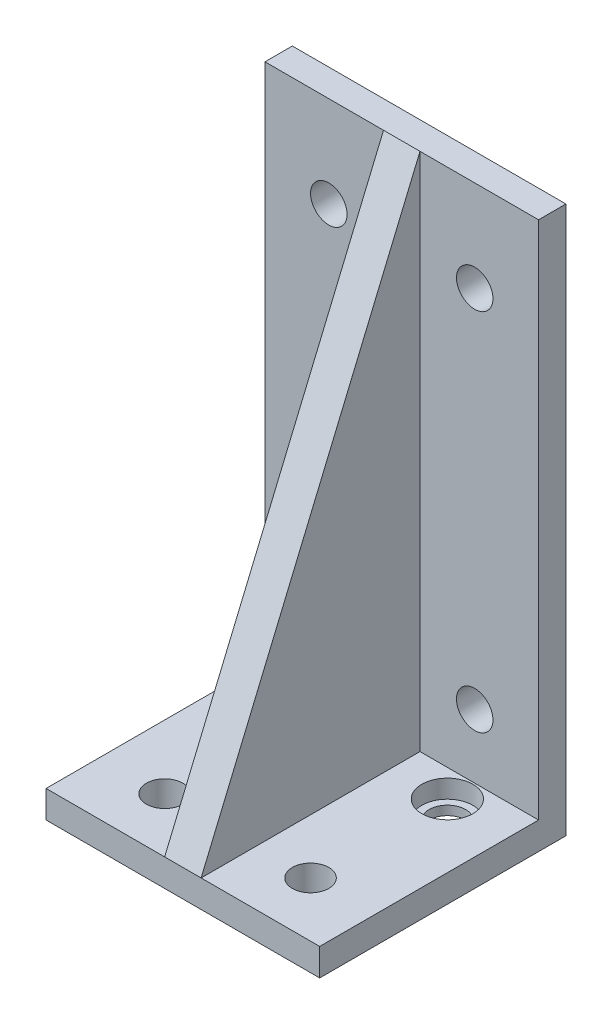
ISO-10303-21;
HEADER;
FILE_DESCRIPTION(('STEP AP214'),'2;1');
FILE_NAME('part.step','',(''),(''),'','','');
FILE_SCHEMA(('AUTOMOTIVE_DESIGN { 1 0 10303 214 1 1 1 1 }'));
ENDSEC;
DATA;
#1=APPLICATION_CONTEXT('core data for automotive mechanical design processes');
#2=APPLICATION_PROTOCOL_DEFINITION('international standard','automotive_design',2000,#1);
#3=PRODUCT_CONTEXT('',#1,'mechanical');
#4=PRODUCT('Part','Part','',(#3));
#5=PRODUCT_RELATED_PRODUCT_CATEGORY('part','',(#4));
#6=PRODUCT_DEFINITION_FORMATION('','',#4);
#7=PRODUCT_DEFINITION_CONTEXT('part definition',#1,'design');
#8=PRODUCT_DEFINITION('design','',#6,#7);
#9=PRODUCT_DEFINITION_SHAPE('','',#8);
#10=(LENGTH_UNIT() NAMED_UNIT(*) SI_UNIT(.MILLI.,.METRE.));
#11=(NAMED_UNIT(*) PLANE_ANGLE_UNIT() SI_UNIT($,.RADIAN.));
#12=(NAMED_UNIT(*) SI_UNIT($,.STERADIAN.) SOLID_ANGLE_UNIT());
#13=UNCERTAINTY_MEASURE_WITH_UNIT(LENGTH_MEASURE(1.E-05),#10,'distance_accuracy_value','');
#14=(GEOMETRIC_REPRESENTATION_CONTEXT(3) GLOBAL_UNCERTAINTY_ASSIGNED_CONTEXT((#13)) GLOBAL_UNIT_ASSIGNED_CONTEXT((#10,
#11,#12)) REPRESENTATION_CONTEXT('',''));
#15=CARTESIAN_POINT('',(0.,0.,0.));
#16=DIRECTION('',(0.,0.,1.));
#17=DIRECTION('',(1.,0.,0.));
#18=AXIS2_PLACEMENT_3D('',#15,#16,#17);
#19=CARTESIAN_POINT('',(-8.,-30.,6.));
#20=DIRECTION('',(0.,1.,0.));
#21=DIRECTION('',(0.,0.,1.));
#22=AXIS2_PLACEMENT_3D('',#19,#20,#21);
#23=CYLINDRICAL_SURFACE('',#22,2.);
#24=CARTESIAN_POINT('',(-8.,-30.,6.));
#25=DIRECTION('',(0.,1.,0.));
#26=DIRECTION('',(0.,0.,1.));
#27=AXIS2_PLACEMENT_3D('',#24,#25,#26);
#28=CIRCLE('',#27,2.);
#29=CARTESIAN_POINT('',(-8.,-30.,8.));
#30=VERTEX_POINT('',#29);
#31=EDGE_CURVE('E225',#30,#30,#28,.T.);
#32=CARTESIAN_POINT('',(-8.,-29.,6.));
#33=DIRECTION('',(0.,1.,0.));
#34=DIRECTION('',(0.,0.,1.));
#35=AXIS2_PLACEMENT_3D('',#32,#33,#34);
#36=CIRCLE('',#35,2.);
#37=CARTESIAN_POINT('',(-8.,-29.,8.));
#38=VERTEX_POINT('',#37);
#39=EDGE_CURVE('E42',#38,#38,#36,.F.);
#40=CARTESIAN_POINT('',(-8.,-30.,8.));
#41=CARTESIAN_POINT('',(-8.,-29.9895833333333,8.));
#42=CARTESIAN_POINT('',(-8.,-29.9791666666667,8.));
#43=CARTESIAN_POINT('',(-8.,-29.9583333333333,8.));
#44=CARTESIAN_POINT('',(-8.,-29.9479166666667,8.));
#45=CARTESIAN_POINT('',(-8.,-29.9270833333333,8.));
#46=CARTESIAN_POINT('',(-8.,-29.9166666666667,8.));
#47=CARTESIAN_POINT('',(-8.,-29.8958333333333,8.));
#48=CARTESIAN_POINT('',(-8.,-29.8854166666667,8.));
#49=CARTESIAN_POINT('',(-8.,-29.8645833333333,8.));
#50=CARTESIAN_POINT('',(-8.,-29.8541666666667,8.));
#51=CARTESIAN_POINT('',(-8.,-29.8333333333333,8.));
#52=CARTESIAN_POINT('',(-8.,-29.8229166666667,8.));
#53=CARTESIAN_POINT('',(-8.,-29.8020833333333,8.));
#54=CARTESIAN_POINT('',(-8.,-29.7916666666667,8.));
#55=CARTESIAN_POINT('',(-8.,-29.7708333333333,8.));
#56=CARTESIAN_POINT('',(-8.,-29.7604166666667,8.));
#57=CARTESIAN_POINT('',(-8.,-29.7395833333333,8.));
#58=CARTESIAN_POINT('',(-8.,-29.7291666666667,8.));
#59=CARTESIAN_POINT('',(-8.,-29.7083333333333,8.));
#60=CARTESIAN_POINT('',(-8.,-29.6979166666667,8.));
#61=CARTESIAN_POINT('',(-8.,-29.6770833333333,8.));
#62=CARTESIAN_POINT('',(-8.,-29.6666666666667,8.));
#63=CARTESIAN_POINT('',(-8.,-29.6458333333333,8.));
#64=CARTESIAN_POINT('',(-8.,-29.6354166666667,8.));
#65=CARTESIAN_POINT('',(-8.,-29.6145833333333,8.));
#66=CARTESIAN_POINT('',(-8.,-29.6041666666667,8.));
#67=CARTESIAN_POINT('',(-8.,-29.5833333333333,8.));
#68=CARTESIAN_POINT('',(-8.,-29.5729166666667,8.));
#69=CARTESIAN_POINT('',(-8.,-29.5520833333333,8.));
#70=CARTESIAN_POINT('',(-8.,-29.5416666666667,8.));
#71=CARTESIAN_POINT('',(-8.,-29.5208333333333,8.));
#72=CARTESIAN_POINT('',(-8.,-29.5104166666667,8.));
#73=CARTESIAN_POINT('',(-8.,-29.4895833333333,8.));
#74=CARTESIAN_POINT('',(-8.,-29.4791666666667,8.));
#75=CARTESIAN_POINT('',(-8.,-29.4583333333333,8.));
#76=CARTESIAN_POINT('',(-8.,-29.4479166666667,8.));
#77=CARTESIAN_POINT('',(-8.,-29.4270833333333,8.));
#78=CARTESIAN_POINT('',(-8.,-29.4166666666667,8.));
#79=CARTESIAN_POINT('',(-8.,-29.3958333333333,8.));
#80=CARTESIAN_POINT('',(-8.,-29.3854166666667,8.));
#81=CARTESIAN_POINT('',(-8.,-29.3645833333333,8.));
#82=CARTESIAN_POINT('',(-8.,-29.3541666666667,8.));
#83=CARTESIAN_POINT('',(-8.,-29.3333333333333,8.));
#84=CARTESIAN_POINT('',(-8.,-29.3229166666667,8.));
#85=CARTESIAN_POINT('',(-8.,-29.3020833333333,8.));
#86=CARTESIAN_POINT('',(-8.,-29.2916666666667,8.));
#87=CARTESIAN_POINT('',(-8.,-29.2708333333333,8.));
#88=CARTESIAN_POINT('',(-8.,-29.2604166666667,8.));
#89=CARTESIAN_POINT('',(-8.,-29.2395833333333,8.));
#90=CARTESIAN_POINT('',(-8.,-29.2291666666667,8.));
#91=CARTESIAN_POINT('',(-8.,-29.2083333333333,8.));
#92=CARTESIAN_POINT('',(-8.,-29.1979166666667,8.));
#93=CARTESIAN_POINT('',(-8.,-29.1770833333333,8.));
#94=CARTESIAN_POINT('',(-8.,-29.1666666666667,8.));
#95=CARTESIAN_POINT('',(-8.,-29.1458333333333,8.));
#96=CARTESIAN_POINT('',(-8.,-29.1354166666667,8.));
#97=CARTESIAN_POINT('',(-8.,-29.1145833333333,8.));
#98=CARTESIAN_POINT('',(-8.,-29.1041666666667,8.));
#99=CARTESIAN_POINT('',(-8.,-29.0833333333333,8.));
#100=CARTESIAN_POINT('',(-8.,-29.0729166666667,8.));
#101=CARTESIAN_POINT('',(-8.,-29.0520833333333,8.));
#102=CARTESIAN_POINT('',(-8.,-29.0416666666667,8.));
#103=CARTESIAN_POINT('',(-8.,-29.0208333333333,8.));
#104=CARTESIAN_POINT('',(-8.,-29.0104166666667,8.));
#105=CARTESIAN_POINT('',(-8.,-29.,8.));
#106=B_SPLINE_CURVE_WITH_KNOTS('',3,(#40,#41,#42,#43,#44,#45,#46,#47,#48,#49,#50,#51,#52,#53,
#54,#55,#56,#57,#58,#59,#60,#61,#62,#63,#64,#65,#66,#67,#68,#69,#70,#71,#72,#73,#74,#75,#76,#77,
#78,#79,#80,#81,#82,#83,#84,#85,#86,#87,#88,#89,#90,#91,#92,#93,#94,#95,#96,#97,#98,#99,#100,
#101,#102,#103,#104,#105),.UNSPECIFIED.,.F.,.F.,(4,2,2,2,2,2,2,2,2,2,2,2,2,2,2,2,2,2,2,2,2,2,2,
2,2,2,2,2,2,2,2,2,4),(0.,0.0312500000000035,0.0625000000000035,0.0937500000000036,
0.125000000000004,0.156250000000004,0.187500000000004,0.218750000000004,0.250000000000004,
0.281250000000004,0.312500000000004,0.343750000000004,0.375000000000004,0.406250000000004,
0.437500000000004,0.468750000000004,0.500000000000004,0.531250000000004,0.562500000000004,
0.593750000000004,0.625000000000004,0.656250000000004,0.687500000000004,0.718750000000004,
0.750000000000004,0.781250000000004,0.812500000000004,0.843750000000004,0.875000000000004,
0.906250000000004,0.937500000000004,0.968750000000004,1.),.UNSPECIFIED.);
#107=EDGE_CURVE('BSEAM38',#30,#38,#106,.T.);
#108=ORIENTED_EDGE('',*,*,#31,.F.);
#109=ORIENTED_EDGE('',*,*,#39,.F.);
#110=ORIENTED_EDGE('',*,*,#107,.T.);
#111=ORIENTED_EDGE('',*,*,#107,.F.);
#112=EDGE_LOOP('',(#108,#110,#109,#111));
#113=FACE_BOUND('',#112,.T.);
#114=ADVANCED_FACE('F38',(#113),#23,.F.);
#115=CARTESIAN_POINT('',(8.,-30.,6.));
#116=DIRECTION('',(0.,1.,0.));
#117=DIRECTION('',(0.,0.,1.));
#118=AXIS2_PLACEMENT_3D('',#115,#116,#117);
#119=CYLINDRICAL_SURFACE('',#118,2.);
#120=CARTESIAN_POINT('',(8.,-30.,6.));
#121=DIRECTION('',(0.,1.,0.));
#122=DIRECTION('',(0.,0.,-1.));
#123=AXIS2_PLACEMENT_3D('',#120,#121,#122);
#124=CIRCLE('',#123,2.);
#125=CARTESIAN_POINT('',(8.,-30.,8.));
#126=VERTEX_POINT('',#125);
#127=EDGE_CURVE('E221',#126,#126,#124,.T.);
#128=CARTESIAN_POINT('',(8.,-29.,6.));
#129=DIRECTION('',(0.,1.,0.));
#130=DIRECTION('',(0.,0.,1.));
#131=AXIS2_PLACEMENT_3D('',#128,#129,#130);
#132=CIRCLE('',#131,2.);
#133=CARTESIAN_POINT('',(8.,-29.,8.));
#134=VERTEX_POINT('',#133);
#135=EDGE_CURVE('E175',#134,#134,#132,.F.);
#136=CARTESIAN_POINT('',(8.,-30.,8.));
#137=CARTESIAN_POINT('',(8.,-29.9895833333333,8.));
#138=CARTESIAN_POINT('',(8.,-29.9791666666667,8.));
#139=CARTESIAN_POINT('',(8.,-29.9583333333333,8.));
#140=CARTESIAN_POINT('',(8.,-29.9479166666667,8.));
#141=CARTESIAN_POINT('',(8.,-29.9270833333333,8.));
#142=CARTESIAN_POINT('',(8.,-29.9166666666667,8.));
#143=CARTESIAN_POINT('',(8.,-29.8958333333333,8.));
#144=CARTESIAN_POINT('',(8.,-29.8854166666667,8.));
#145=CARTESIAN_POINT('',(8.,-29.8645833333333,8.));
#146=CARTESIAN_POINT('',(8.,-29.8541666666667,8.));
#147=CARTESIAN_POINT('',(8.,-29.8333333333333,8.));
#148=CARTESIAN_POINT('',(8.,-29.8229166666667,8.));
#149=CARTESIAN_POINT('',(8.,-29.8020833333333,8.));
#150=CARTESIAN_POINT('',(8.,-29.7916666666667,8.));
#151=CARTESIAN_POINT('',(8.,-29.7708333333333,8.));
#152=CARTESIAN_POINT('',(8.,-29.7604166666667,8.));
#153=CARTESIAN_POINT('',(8.,-29.7395833333333,8.));
#154=CARTESIAN_POINT('',(8.,-29.7291666666667,8.));
#155=CARTESIAN_POINT('',(8.,-29.7083333333333,8.));
#156=CARTESIAN_POINT('',(8.,-29.6979166666667,8.));
#157=CARTESIAN_POINT('',(8.,-29.6770833333333,8.));
#158=CARTESIAN_POINT('',(8.,-29.6666666666667,8.));
#159=CARTESIAN_POINT('',(8.,-29.6458333333333,8.));
#160=CARTESIAN_POINT('',(8.,-29.6354166666667,8.));
#161=CARTESIAN_POINT('',(8.,-29.6145833333333,8.));
#162=CARTESIAN_POINT('',(8.,-29.6041666666667,8.));
#163=CARTESIAN_POINT('',(8.,-29.5833333333333,8.));
#164=CARTESIAN_POINT('',(8.,-29.5729166666667,8.));
#165=CARTESIAN_POINT('',(8.,-29.5520833333333,8.));
#166=CARTESIAN_POINT('',(8.,-29.5416666666667,8.));
#167=CARTESIAN_POINT('',(8.,-29.5208333333333,8.));
#168=CARTESIAN_POINT('',(8.,-29.5104166666667,8.));
#169=CARTESIAN_POINT('',(8.,-29.4895833333333,8.));
#170=CARTESIAN_POINT('',(8.,-29.4791666666667,8.));
#171=CARTESIAN_POINT('',(8.,-29.4583333333333,8.));
#172=CARTESIAN_POINT('',(8.,-29.4479166666667,8.));
#173=CARTESIAN_POINT('',(8.,-29.4270833333333,8.));
#174=CARTESIAN_POINT('',(8.,-29.4166666666667,8.));
#175=CARTESIAN_POINT('',(8.,-29.3958333333333,8.));
#176=CARTESIAN_POINT('',(8.,-29.3854166666667,8.));
#177=CARTESIAN_POINT('',(8.,-29.3645833333333,8.));
#178=CARTESIAN_POINT('',(8.,-29.3541666666667,8.));
#179=CARTESIAN_POINT('',(8.,-29.3333333333333,8.));
#180=CARTESIAN_POINT('',(8.,-29.3229166666667,8.));
#181=CARTESIAN_POINT('',(8.,-29.3020833333333,8.));
#182=CARTESIAN_POINT('',(8.,-29.2916666666667,8.));
#183=CARTESIAN_POINT('',(8.,-29.2708333333333,8.));
#184=CARTESIAN_POINT('',(8.,-29.2604166666667,8.));
#185=CARTESIAN_POINT('',(8.,-29.2395833333333,8.));
#186=CARTESIAN_POINT('',(8.,-29.2291666666667,8.));
#187=CARTESIAN_POINT('',(8.,-29.2083333333333,8.));
#188=CARTESIAN_POINT('',(8.,-29.1979166666667,8.));
#189=CARTESIAN_POINT('',(8.,-29.1770833333333,8.));
#190=CARTESIAN_POINT('',(8.,-29.1666666666667,8.));
#191=CARTESIAN_POINT('',(8.,-29.1458333333333,8.));
#192=CARTESIAN_POINT('',(8.,-29.1354166666667,8.));
#193=CARTESIAN_POINT('',(8.,-29.1145833333333,8.));
#194=CARTESIAN_POINT('',(8.,-29.1041666666667,8.));
#195=CARTESIAN_POINT('',(8.,-29.0833333333333,8.));
#196=CARTESIAN_POINT('',(8.,-29.0729166666667,8.));
#197=CARTESIAN_POINT('',(8.,-29.0520833333333,8.));
#198=CARTESIAN_POINT('',(8.,-29.0416666666667,8.));
#199=CARTESIAN_POINT('',(8.,-29.0208333333333,8.));
#200=CARTESIAN_POINT('',(8.,-29.0104166666667,8.));
#201=CARTESIAN_POINT('',(8.,-29.,8.));
#202=B_SPLINE_CURVE_WITH_KNOTS('',3,(#136,#137,#138,#139,#140,#141,#142,#143,#144,#145,#146,
#147,#148,#149,#150,#151,#152,#153,#154,#155,#156,#157,#158,#159,#160,#161,#162,#163,#164,#165,
#166,#167,#168,#169,#170,#171,#172,#173,#174,#175,#176,#177,#178,#179,#180,#181,#182,#183,#184,
#185,#186,#187,#188,#189,#190,#191,#192,#193,#194,#195,#196,#197,#198,#199,#200,#201),
.UNSPECIFIED.,.F.,.F.,(4,2,2,2,2,2,2,2,2,2,2,2,2,2,2,2,2,2,2,2,2,2,2,2,2,2,2,2,2,2,2,2,4),(0.,
0.0312500000000035,0.0625000000000035,0.0937500000000036,0.125000000000004,0.156250000000004,
0.187500000000004,0.218750000000004,0.250000000000004,0.281250000000004,0.312500000000004,
0.343750000000004,0.375000000000004,0.406250000000004,0.437500000000004,0.468750000000004,
0.500000000000004,0.531250000000004,0.562500000000004,0.593750000000004,0.625000000000004,
0.656250000000004,0.687500000000004,0.718750000000004,0.750000000000004,0.781250000000004,
0.812500000000004,0.843750000000004,0.875000000000004,0.906250000000004,0.937500000000004,
0.968750000000004,1.),.UNSPECIFIED.);
#203=EDGE_CURVE('BSEAM335',#126,#134,#202,.T.);
#204=ORIENTED_EDGE('',*,*,#127,.F.);
#205=ORIENTED_EDGE('',*,*,#135,.F.);
#206=ORIENTED_EDGE('',*,*,#203,.T.);
#207=ORIENTED_EDGE('',*,*,#203,.F.);
#208=EDGE_LOOP('',(#204,#206,#205,#207));
#209=FACE_BOUND('',#208,.T.);
#210=ADVANCED_FACE('F335',(#209),#119,.F.);
#211=CARTESIAN_POINT('',(0.,0.,3.));
#212=DIRECTION('',(0.,0.,-1.));
#213=DIRECTION('',(-1.,0.,0.));
#214=AXIS2_PLACEMENT_3D('',#211,#212,#213);
#215=PLANE('',#214);
#216=CARTESIAN_POINT('',(8.00000000000002,-20.,3.));
#217=DIRECTION('',(0.,0.,1.));
#218=DIRECTION('',(-1.,0.,0.));
#219=AXIS2_PLACEMENT_3D('',#216,#217,#218);
#220=CIRCLE('',#219,2.);
#221=CARTESIAN_POINT('',(6.00000000000002,-20.,3.));
#222=VERTEX_POINT('',#221);
#223=EDGE_CURVE('E280',#222,#222,#220,.T.);
#224=ORIENTED_EDGE('',*,*,#223,.F.);
#225=EDGE_LOOP('',(#224));
#226=FACE_BOUND('',#225,.T.);
#227=CARTESIAN_POINT('',(8.,20.,3.));
#228=DIRECTION('',(0.,0.,1.));
#229=DIRECTION('',(1.,0.,0.));
#230=AXIS2_PLACEMENT_3D('',#227,#228,#229);
#231=CIRCLE('',#230,2.);
#232=CARTESIAN_POINT('',(10.,20.,3.));
#233=VERTEX_POINT('',#232);
#234=EDGE_CURVE('E161',#233,#233,#231,.T.);
#235=ORIENTED_EDGE('',*,*,#234,.F.);
#236=EDGE_LOOP('',(#235));
#237=FACE_BOUND('',#236,.T.);
#238=DIRECTION('',(0.,1.,0.));
#239=VECTOR('',#238,1.);
#240=CARTESIAN_POINT('',(2.,-27.,3.));
#241=LINE('',#240,#239);
#242=CARTESIAN_POINT('',(2.,-27.,3.));
#243=VERTEX_POINT('',#242);
#244=CARTESIAN_POINT('',(2.,30.,3.));
#245=VERTEX_POINT('',#244);
#246=EDGE_CURVE('E125',#243,#245,#241,.T.);
#247=ORIENTED_EDGE('',*,*,#246,.F.);
#248=DIRECTION('',(-1.,0.,0.));
#249=VECTOR('',#248,1.);
#250=CARTESIAN_POINT('',(15.,-27.,3.));
#251=LINE('',#250,#249);
#252=CARTESIAN_POINT('',(15.,-27.,3.));
#253=VERTEX_POINT('',#252);
#254=EDGE_CURVE('E64',#253,#243,#251,.T.);
#255=ORIENTED_EDGE('',*,*,#254,.F.);
#256=DIRECTION('',(0.,1.,0.));
#257=VECTOR('',#256,1.);
#258=CARTESIAN_POINT('',(15.,30.,3.));
#259=LINE('',#258,#257);
#260=CARTESIAN_POINT('',(15.,30.,3.));
#261=VERTEX_POINT('',#260);
#262=EDGE_CURVE('E143',#253,#261,#259,.T.);
#263=ORIENTED_EDGE('',*,*,#262,.T.);
#264=DIRECTION('',(-1.,0.,0.));
#265=VECTOR('',#264,1.);
#266=CARTESIAN_POINT('',(15.,30.,3.));
#267=LINE('',#266,#265);
#268=EDGE_CURVE('E136',#261,#245,#267,.T.);
#269=ORIENTED_EDGE('',*,*,#268,.T.);
#270=EDGE_LOOP('',(#247,#255,#263,#269));
#271=FACE_BOUND('',#270,.T.);
#272=ADVANCED_FACE('F142',(#226,#237,#271),#215,.F.);
#273=CARTESIAN_POINT('',(15.,-27.,3.));
#274=DIRECTION('',(0.,-1.,0.));
#275=DIRECTION('',(0.,0.,-1.));
#276=AXIS2_PLACEMENT_3D('',#273,#274,#275);
#277=PLANE('',#276);
#278=CARTESIAN_POINT('',(8.,-27.,6.));
#279=DIRECTION('',(0.,1.,0.));
#280=DIRECTION('',(0.,0.,1.));
#281=AXIS2_PLACEMENT_3D('',#278,#279,#280);
#282=CIRCLE('',#281,2.8);
#283=CARTESIAN_POINT('',(8.,-27.,8.8));
#284=VERTEX_POINT('',#283);
#285=EDGE_CURVE('E198',#284,#284,#282,.T.);
#286=ORIENTED_EDGE('',*,*,#285,.F.);
#287=EDGE_LOOP('',(#286));
#288=FACE_BOUND('',#287,.T.);
#289=CARTESIAN_POINT('',(8.,-27.,21.));
#290=DIRECTION('',(0.,1.,0.));
#291=DIRECTION('',(0.,0.,1.));
#292=AXIS2_PLACEMENT_3D('',#289,#290,#291);
#293=CIRCLE('',#292,2.);
#294=CARTESIAN_POINT('',(8.,-27.,23.));
#295=VERTEX_POINT('',#294);
#296=EDGE_CURVE('E140',#295,#295,#293,.T.);
#297=ORIENTED_EDGE('',*,*,#296,.F.);
#298=EDGE_LOOP('',(#297));
#299=FACE_BOUND('',#298,.T.);
#300=DIRECTION('',(0.,0.,-1.));
#301=VECTOR('',#300,1.);
#302=CARTESIAN_POINT('',(2.,-27.,27.));
#303=LINE('',#302,#301);
#304=CARTESIAN_POINT('',(2.,-27.,27.));
#305=VERTEX_POINT('',#304);
#306=EDGE_CURVE('E124',#305,#243,#303,.T.);
#307=ORIENTED_EDGE('',*,*,#306,.F.);
#308=DIRECTION('',(-1.,0.,0.));
#309=VECTOR('',#308,1.);
#310=CARTESIAN_POINT('',(15.,-27.,27.));
#311=LINE('',#310,#309);
#312=CARTESIAN_POINT('',(15.,-27.,27.));
#313=VERTEX_POINT('',#312);
#314=EDGE_CURVE('E256',#313,#305,#311,.T.);
#315=ORIENTED_EDGE('',*,*,#314,.F.);
#316=DIRECTION('',(0.,0.,1.));
#317=VECTOR('',#316,1.);
#318=CARTESIAN_POINT('',(15.,-27.,3.));
#319=LINE('',#318,#317);
#320=EDGE_CURVE('E237',#253,#313,#319,.T.);
#321=ORIENTED_EDGE('',*,*,#320,.F.);
#322=ORIENTED_EDGE('',*,*,#254,.T.);
#323=EDGE_LOOP('',(#307,#315,#321,#322));
#324=FACE_BOUND('',#323,.T.);
#325=ADVANCED_FACE('F315',(#288,#299,#324),#277,.F.);
#326=CARTESIAN_POINT('',(-8.00000000000001,-20.,3.));
#327=DIRECTION('',(0.,0.,1.));
#328=DIRECTION('',(1.,0.,0.));
#329=AXIS2_PLACEMENT_3D('',#326,#327,#328);
#330=CIRCLE('',#329,2.);
#331=CARTESIAN_POINT('',(-6.00000000000001,-20.,3.));
#332=VERTEX_POINT('',#331);
#333=EDGE_CURVE('E264',#332,#332,#330,.T.);
#334=ORIENTED_EDGE('',*,*,#333,.F.);
#335=EDGE_LOOP('',(#334));
#336=FACE_BOUND('',#335,.T.);
#337=CARTESIAN_POINT('',(-8.,20.,3.));
#338=DIRECTION('',(0.,0.,1.));
#339=DIRECTION('',(-1.,0.,0.));
#340=AXIS2_PLACEMENT_3D('',#337,#338,#339);
#341=CIRCLE('',#340,2.);
#342=CARTESIAN_POINT('',(-10.,20.,3.));
#343=VERTEX_POINT('',#342);
#344=EDGE_CURVE('E272',#343,#343,#341,.T.);
#345=ORIENTED_EDGE('',*,*,#344,.F.);
#346=EDGE_LOOP('',(#345));
#347=FACE_BOUND('',#346,.T.);
#348=CARTESIAN_POINT('',(-2.,-27.,3.));
#349=VERTEX_POINT('',#348);
#350=CARTESIAN_POINT('',(-15.,-27.,3.));
#351=VERTEX_POINT('',#350);
#352=EDGE_CURVE('E260',#349,#351,#251,.T.);
#353=ORIENTED_EDGE('',*,*,#352,.F.);
#354=DIRECTION('',(0.,1.,0.));
#355=VECTOR('',#354,1.);
#356=CARTESIAN_POINT('',(-2.,-27.,3.));
#357=LINE('',#356,#355);
#358=CARTESIAN_POINT('',(-2.,30.,3.));
#359=VERTEX_POINT('',#358);
#360=EDGE_CURVE('E184',#349,#359,#357,.T.);
#361=ORIENTED_EDGE('',*,*,#360,.T.);
#362=CARTESIAN_POINT('',(-15.,30.,3.));
#363=VERTEX_POINT('',#362);
#364=EDGE_CURVE('E138',#359,#363,#267,.T.);
#365=ORIENTED_EDGE('',*,*,#364,.T.);
#366=DIRECTION('',(0.,-1.,0.));
#367=VECTOR('',#366,1.);
#368=CARTESIAN_POINT('',(-15.,30.,3.));
#369=LINE('',#368,#367);
#370=EDGE_CURVE('E169',#363,#351,#369,.T.);
#371=ORIENTED_EDGE('',*,*,#370,.T.);
#372=EDGE_LOOP('',(#353,#361,#365,#371));
#373=FACE_BOUND('',#372,.T.);
#374=ADVANCED_FACE('F300',(#336,#347,#373),#215,.F.);
#375=CARTESIAN_POINT('',(0.,0.,0.));
#376=DIRECTION('',(0.,0.,-1.));
#377=DIRECTION('',(-1.,0.,0.));
#378=AXIS2_PLACEMENT_3D('',#375,#376,#377);
#379=PLANE('',#378);
#380=CARTESIAN_POINT('',(-8.,20.,0.));
#381=DIRECTION('',(0.,0.,1.));
#382=DIRECTION('',(-1.,0.,0.));
#383=AXIS2_PLACEMENT_3D('',#380,#381,#382);
#384=CIRCLE('',#383,2.);
#385=CARTESIAN_POINT('',(-10.,20.,0.));
#386=VERTEX_POINT('',#385);
#387=EDGE_CURVE('E268',#386,#386,#384,.T.);
#388=ORIENTED_EDGE('',*,*,#387,.T.);
#389=EDGE_LOOP('',(#388));
#390=FACE_BOUND('',#389,.T.);
#391=CARTESIAN_POINT('',(8.,20.,0.));
#392=DIRECTION('',(0.,0.,1.));
#393=DIRECTION('',(1.,0.,0.));
#394=AXIS2_PLACEMENT_3D('',#391,#392,#393);
#395=CIRCLE('',#394,2.);
#396=CARTESIAN_POINT('',(10.,20.,0.));
#397=VERTEX_POINT('',#396);
#398=EDGE_CURVE('E284',#397,#397,#395,.T.);
#399=ORIENTED_EDGE('',*,*,#398,.T.);
#400=EDGE_LOOP('',(#399));
#401=FACE_BOUND('',#400,.T.);
#402=DIRECTION('',(0.,-1.,0.));
#403=VECTOR('',#402,1.);
#404=CARTESIAN_POINT('',(-15.,30.,0.));
#405=LINE('',#404,#403);
#406=CARTESIAN_POINT('',(-15.,30.,0.));
#407=VERTEX_POINT('',#406);
#408=CARTESIAN_POINT('',(-15.,-30.,0.));
#409=VERTEX_POINT('',#408);
#410=EDGE_CURVE('E156',#407,#409,#405,.T.);
#411=ORIENTED_EDGE('',*,*,#410,.F.);
#412=DIRECTION('',(-1.,0.,0.));
#413=VECTOR('',#412,1.);
#414=CARTESIAN_POINT('',(15.,30.,0.));
#415=LINE('',#414,#413);
#416=CARTESIAN_POINT('',(15.,30.,0.));
#417=VERTEX_POINT('',#416);
#418=EDGE_CURVE('E167',#417,#407,#415,.T.);
#419=ORIENTED_EDGE('',*,*,#418,.F.);
#420=DIRECTION('',(0.,1.,0.));
#421=VECTOR('',#420,1.);
#422=CARTESIAN_POINT('',(15.,30.,0.));
#423=LINE('',#422,#421);
#424=CARTESIAN_POINT('',(15.,-30.,0.));
#425=VERTEX_POINT('',#424);
#426=EDGE_CURVE('E164',#425,#417,#423,.T.);
#427=ORIENTED_EDGE('',*,*,#426,.F.);
#428=DIRECTION('',(1.,0.,0.));
#429=VECTOR('',#428,1.);
#430=CARTESIAN_POINT('',(15.,-30.,0.));
#431=LINE('',#430,#429);
#432=EDGE_CURVE('E160',#409,#425,#431,.T.);
#433=ORIENTED_EDGE('',*,*,#432,.F.);
#434=EDGE_LOOP('',(#411,#419,#427,#433));
#435=FACE_BOUND('',#434,.T.);
#436=CARTESIAN_POINT('',(8.00000000000002,-20.,0.));
#437=DIRECTION('',(0.,0.,1.));
#438=DIRECTION('',(-1.,0.,0.));
#439=AXIS2_PLACEMENT_3D('',#436,#437,#438);
#440=CIRCLE('',#439,2.);
#441=CARTESIAN_POINT('',(6.00000000000002,-20.,0.));
#442=VERTEX_POINT('',#441);
#443=EDGE_CURVE('E276',#442,#442,#440,.T.);
#444=ORIENTED_EDGE('',*,*,#443,.T.);
#445=EDGE_LOOP('',(#444));
#446=FACE_BOUND('',#445,.T.);
#447=CARTESIAN_POINT('',(-8.00000000000001,-20.,0.));
#448=DIRECTION('',(0.,0.,1.));
#449=DIRECTION('',(1.,0.,0.));
#450=AXIS2_PLACEMENT_3D('',#447,#448,#449);
#451=CIRCLE('',#450,2.);
#452=CARTESIAN_POINT('',(-6.00000000000001,-20.,0.));
#453=VERTEX_POINT('',#452);
#454=EDGE_CURVE('E263',#453,#453,#451,.T.);
#455=ORIENTED_EDGE('',*,*,#454,.T.);
#456=EDGE_LOOP('',(#455));
#457=FACE_BOUND('',#456,.T.);
#458=ADVANCED_FACE('F322',(#390,#401,#435,#446,#457),#379,.T.);
#459=CARTESIAN_POINT('',(-15.,30.,3.));
#460=DIRECTION('',(1.,0.,0.));
#461=DIRECTION('',(0.,1.,0.));
#462=AXIS2_PLACEMENT_3D('',#459,#460,#461);
#463=PLANE('',#462);
#464=ORIENTED_EDGE('',*,*,#410,.T.);
#465=DIRECTION('',(0.,0.,-1.));
#466=VECTOR('',#465,1.);
#467=CARTESIAN_POINT('',(-15.,-30.,3.));
#468=LINE('',#467,#466);
#469=CARTESIAN_POINT('',(-15.,-30.,27.));
#470=VERTEX_POINT('',#469);
#471=EDGE_CURVE('E11',#470,#409,#468,.T.);
#472=ORIENTED_EDGE('',*,*,#471,.F.);
#473=DIRECTION('',(0.,-1.,0.));
#474=VECTOR('',#473,1.);
#475=CARTESIAN_POINT('',(-15.,-30.,27.));
#476=LINE('',#475,#474);
#477=CARTESIAN_POINT('',(-15.,-27.,27.));
#478=VERTEX_POINT('',#477);
#479=EDGE_CURVE('E241',#478,#470,#476,.T.);
#480=ORIENTED_EDGE('',*,*,#479,.F.);
#481=DIRECTION('',(0.,0.,1.));
#482=VECTOR('',#481,1.);
#483=CARTESIAN_POINT('',(-15.,-27.,3.));
#484=LINE('',#483,#482);
#485=EDGE_CURVE('E236',#351,#478,#484,.T.);
#486=ORIENTED_EDGE('',*,*,#485,.F.);
#487=ORIENTED_EDGE('',*,*,#370,.F.);
#488=DIRECTION('',(0.,0.,-1.));
#489=VECTOR('',#488,1.);
#490=CARTESIAN_POINT('',(-15.,30.,3.));
#491=LINE('',#490,#489);
#492=EDGE_CURVE('E146',#363,#407,#491,.T.);
#493=ORIENTED_EDGE('',*,*,#492,.T.);
#494=EDGE_LOOP('',(#464,#472,#480,#486,#487,#493));
#495=FACE_BOUND('',#494,.T.);
#496=ADVANCED_FACE('F40',(#495),#463,.F.);
#497=CARTESIAN_POINT('',(15.,-30.,3.));
#498=DIRECTION('',(0.,1.,0.));
#499=DIRECTION('',(-1.,0.,0.));
#500=AXIS2_PLACEMENT_3D('',#497,#498,#499);
#501=PLANE('',#500);
#502=ORIENTED_EDGE('',*,*,#127,.T.);
#503=EDGE_LOOP('',(#502));
#504=FACE_BOUND('',#503,.T.);
#505=CARTESIAN_POINT('',(-8.,-30.,21.));
#506=DIRECTION('',(0.,1.,0.));
#507=DIRECTION('',(0.,0.,1.));
#508=AXIS2_PLACEMENT_3D('',#505,#506,#507);
#509=CIRCLE('',#508,2.);
#510=CARTESIAN_POINT('',(-8.,-30.,23.));
#511=VERTEX_POINT('',#510);
#512=EDGE_CURVE('E226',#511,#511,#509,.T.);
#513=ORIENTED_EDGE('',*,*,#512,.T.);
#514=EDGE_LOOP('',(#513));
#515=FACE_BOUND('',#514,.T.);
#516=CARTESIAN_POINT('',(8.,-30.,21.));
#517=DIRECTION('',(0.,1.,0.));
#518=DIRECTION('',(0.,0.,1.));
#519=AXIS2_PLACEMENT_3D('',#516,#517,#518);
#520=CIRCLE('',#519,2.);
#521=CARTESIAN_POINT('',(8.,-30.,23.));
#522=VERTEX_POINT('',#521);
#523=EDGE_CURVE('E213',#522,#522,#520,.T.);
#524=ORIENTED_EDGE('',*,*,#523,.T.);
#525=EDGE_LOOP('',(#524));
#526=FACE_BOUND('',#525,.T.);
#527=ORIENTED_EDGE('',*,*,#31,.T.);
#528=EDGE_LOOP('',(#527));
#529=FACE_BOUND('',#528,.T.);
#530=ORIENTED_EDGE('',*,*,#432,.T.);
#531=DIRECTION('',(0.,0.,-1.));
#532=VECTOR('',#531,1.);
#533=CARTESIAN_POINT('',(15.,-30.,3.));
#534=LINE('',#533,#532);
#535=CARTESIAN_POINT('',(15.,-30.,27.));
#536=VERTEX_POINT('',#535);
#537=EDGE_CURVE('E48',#536,#425,#534,.T.);
#538=ORIENTED_EDGE('',*,*,#537,.F.);
#539=DIRECTION('',(-1.,0.,0.));
#540=VECTOR('',#539,1.);
#541=CARTESIAN_POINT('',(15.,-30.,27.));
#542=LINE('',#541,#540);
#543=EDGE_CURVE('E245',#536,#470,#542,.T.);
#544=ORIENTED_EDGE('',*,*,#543,.T.);
#545=ORIENTED_EDGE('',*,*,#471,.T.);
#546=EDGE_LOOP('',(#530,#538,#544,#545));
#547=FACE_BOUND('',#546,.T.);
#548=ADVANCED_FACE('F325',(#504,#515,#526,#529,#547),#501,.F.);
#549=CARTESIAN_POINT('',(15.,30.,3.));
#550=DIRECTION('',(-1.,0.,0.));
#551=DIRECTION('',(0.,-1.,0.));
#552=AXIS2_PLACEMENT_3D('',#549,#550,#551);
#553=PLANE('',#552);
#554=ORIENTED_EDGE('',*,*,#426,.T.);
#555=DIRECTION('',(0.,0.,-1.));
#556=VECTOR('',#555,1.);
#557=CARTESIAN_POINT('',(15.,30.,3.));
#558=LINE('',#557,#556);
#559=EDGE_CURVE('E151',#261,#417,#558,.T.);
#560=ORIENTED_EDGE('',*,*,#559,.F.);
#561=ORIENTED_EDGE('',*,*,#262,.F.);
#562=ORIENTED_EDGE('',*,*,#320,.T.);
#563=DIRECTION('',(0.,-1.,0.));
#564=VECTOR('',#563,1.);
#565=CARTESIAN_POINT('',(15.,-30.,27.));
#566=LINE('',#565,#564);
#567=EDGE_CURVE('E240',#313,#536,#566,.T.);
#568=ORIENTED_EDGE('',*,*,#567,.T.);
#569=ORIENTED_EDGE('',*,*,#537,.T.);
#570=EDGE_LOOP('',(#554,#560,#561,#562,#568,#569));
#571=FACE_BOUND('',#570,.T.);
#572=ADVANCED_FACE('F317',(#571),#553,.F.);
#573=CARTESIAN_POINT('',(15.,30.,3.));
#574=DIRECTION('',(0.,-1.,0.));
#575=DIRECTION('',(1.,0.,0.));
#576=AXIS2_PLACEMENT_3D('',#573,#574,#575);
#577=PLANE('',#576);
#578=ORIENTED_EDGE('',*,*,#418,.T.);
#579=ORIENTED_EDGE('',*,*,#492,.F.);
#580=ORIENTED_EDGE('',*,*,#364,.F.);
#581=DIRECTION('',(-1.,0.,0.));
#582=VECTOR('',#581,1.);
#583=CARTESIAN_POINT('',(2.,30.,3.));
#584=LINE('',#583,#582);
#585=EDGE_CURVE('E117',#245,#359,#584,.T.);
#586=ORIENTED_EDGE('',*,*,#585,.F.);
#587=ORIENTED_EDGE('',*,*,#268,.F.);
#588=ORIENTED_EDGE('',*,*,#559,.T.);
#589=EDGE_LOOP('',(#578,#579,#580,#586,#587,#588));
#590=FACE_BOUND('',#589,.T.);
#591=ADVANCED_FACE('F134',(#590),#577,.F.);
#592=CARTESIAN_POINT('',(8.,20.,3.));
#593=DIRECTION('',(0.,0.,-1.));
#594=DIRECTION('',(-1.,0.,0.));
#595=AXIS2_PLACEMENT_3D('',#592,#593,#594);
#596=CYLINDRICAL_SURFACE('',#595,2.);
#597=ORIENTED_EDGE('',*,*,#234,.T.);
#598=EDGE_LOOP('',(#597));
#599=FACE_BOUND('',#598,.T.);
#600=ORIENTED_EDGE('',*,*,#398,.F.);
#601=EDGE_LOOP('',(#600));
#602=FACE_BOUND('',#601,.T.);
#603=ADVANCED_FACE('F366',(#599,#602),#596,.F.);
#604=CARTESIAN_POINT('',(8.00000000000002,-20.,3.));
#605=DIRECTION('',(0.,0.,-1.));
#606=DIRECTION('',(-1.,0.,0.));
#607=AXIS2_PLACEMENT_3D('',#604,#605,#606);
#608=CYLINDRICAL_SURFACE('',#607,2.);
#609=ORIENTED_EDGE('',*,*,#223,.T.);
#610=EDGE_LOOP('',(#609));
#611=FACE_BOUND('',#610,.T.);
#612=ORIENTED_EDGE('',*,*,#443,.F.);
#613=EDGE_LOOP('',(#612));
#614=FACE_BOUND('',#613,.T.);
#615=ADVANCED_FACE('F362',(#611,#614),#608,.F.);
#616=CARTESIAN_POINT('',(-8.,20.,3.));
#617=DIRECTION('',(0.,0.,-1.));
#618=DIRECTION('',(-1.,0.,0.));
#619=AXIS2_PLACEMENT_3D('',#616,#617,#618);
#620=CYLINDRICAL_SURFACE('',#619,2.);
#621=ORIENTED_EDGE('',*,*,#344,.T.);
#622=EDGE_LOOP('',(#621));
#623=FACE_BOUND('',#622,.T.);
#624=ORIENTED_EDGE('',*,*,#387,.F.);
#625=EDGE_LOOP('',(#624));
#626=FACE_BOUND('',#625,.T.);
#627=ADVANCED_FACE('F358',(#623,#626),#620,.F.);
#628=CARTESIAN_POINT('',(-8.00000000000001,-20.,3.));
#629=DIRECTION('',(0.,0.,-1.));
#630=DIRECTION('',(-1.,0.,0.));
#631=AXIS2_PLACEMENT_3D('',#628,#629,#630);
#632=CYLINDRICAL_SURFACE('',#631,2.);
#633=ORIENTED_EDGE('',*,*,#333,.T.);
#634=EDGE_LOOP('',(#633));
#635=FACE_BOUND('',#634,.T.);
#636=ORIENTED_EDGE('',*,*,#454,.F.);
#637=EDGE_LOOP('',(#636));
#638=FACE_BOUND('',#637,.T.);
#639=ADVANCED_FACE('F354',(#635,#638),#632,.F.);
#640=CARTESIAN_POINT('',(-8.,-27.,6.));
#641=DIRECTION('',(0.,1.,0.));
#642=DIRECTION('',(0.,0.,1.));
#643=AXIS2_PLACEMENT_3D('',#640,#641,#642);
#644=CIRCLE('',#643,2.8);
#645=CARTESIAN_POINT('',(-8.,-27.,8.8));
#646=VERTEX_POINT('',#645);
#647=EDGE_CURVE('E186',#646,#646,#644,.T.);
#648=ORIENTED_EDGE('',*,*,#647,.F.);
#649=EDGE_LOOP('',(#648));
#650=FACE_BOUND('',#649,.T.);
#651=CARTESIAN_POINT('',(-8.,-27.,21.));
#652=DIRECTION('',(0.,1.,0.));
#653=DIRECTION('',(0.,0.,1.));
#654=AXIS2_PLACEMENT_3D('',#651,#652,#653);
#655=CIRCLE('',#654,2.);
#656=CARTESIAN_POINT('',(-8.,-27.,23.));
#657=VERTEX_POINT('',#656);
#658=EDGE_CURVE('E217',#657,#657,#655,.T.);
#659=ORIENTED_EDGE('',*,*,#658,.F.);
#660=EDGE_LOOP('',(#659));
#661=FACE_BOUND('',#660,.T.);
#662=CARTESIAN_POINT('',(-2.,-27.,27.));
#663=VERTEX_POINT('',#662);
#664=EDGE_CURVE('E255',#663,#478,#311,.T.);
#665=ORIENTED_EDGE('',*,*,#664,.F.);
#666=DIRECTION('',(0.,0.,-1.));
#667=VECTOR('',#666,1.);
#668=CARTESIAN_POINT('',(-2.,-27.,27.));
#669=LINE('',#668,#667);
#670=EDGE_CURVE('E56',#663,#349,#669,.T.);
#671=ORIENTED_EDGE('',*,*,#670,.T.);
#672=ORIENTED_EDGE('',*,*,#352,.T.);
#673=ORIENTED_EDGE('',*,*,#485,.T.);
#674=EDGE_LOOP('',(#665,#671,#672,#673));
#675=FACE_BOUND('',#674,.T.);
#676=ADVANCED_FACE('F305',(#650,#661,#675),#277,.F.);
#677=CARTESIAN_POINT('',(15.,-30.,27.));
#678=DIRECTION('',(0.,0.,-1.));
#679=DIRECTION('',(-1.,0.,0.));
#680=AXIS2_PLACEMENT_3D('',#677,#678,#679);
#681=PLANE('',#680);
#682=ORIENTED_EDGE('',*,*,#479,.T.);
#683=ORIENTED_EDGE('',*,*,#543,.F.);
#684=ORIENTED_EDGE('',*,*,#567,.F.);
#685=ORIENTED_EDGE('',*,*,#314,.T.);
#686=DIRECTION('',(-1.,0.,0.));
#687=VECTOR('',#686,1.);
#688=CARTESIAN_POINT('',(2.,-27.,27.));
#689=LINE('',#688,#687);
#690=EDGE_CURVE('E120',#305,#663,#689,.T.);
#691=ORIENTED_EDGE('',*,*,#690,.T.);
#692=ORIENTED_EDGE('',*,*,#664,.T.);
#693=EDGE_LOOP('',(#682,#683,#684,#685,#691,#692));
#694=FACE_BOUND('',#693,.T.);
#695=ADVANCED_FACE('F309',(#694),#681,.F.);
#696=CARTESIAN_POINT('',(8.,-30.,21.));
#697=DIRECTION('',(0.,1.,0.));
#698=DIRECTION('',(0.,0.,1.));
#699=AXIS2_PLACEMENT_3D('',#696,#697,#698);
#700=CYLINDRICAL_SURFACE('',#699,2.);
#701=CARTESIAN_POINT('',(8.,-30.,23.));
#702=CARTESIAN_POINT('',(8.,-29.96875,23.));
#703=CARTESIAN_POINT('',(8.,-29.9375,23.));
#704=CARTESIAN_POINT('',(8.,-29.875,23.));
#705=CARTESIAN_POINT('',(8.,-29.84375,23.));
#706=CARTESIAN_POINT('',(8.,-29.78125,23.));
#707=CARTESIAN_POINT('',(8.,-29.75,23.));
#708=CARTESIAN_POINT('',(8.,-29.6875,23.));
#709=CARTESIAN_POINT('',(8.,-29.65625,23.));
#710=CARTESIAN_POINT('',(8.,-29.59375,23.));
#711=CARTESIAN_POINT('',(8.,-29.5625,23.));
#712=CARTESIAN_POINT('',(8.,-29.5,23.));
#713=CARTESIAN_POINT('',(8.,-29.46875,23.));
#714=CARTESIAN_POINT('',(8.,-29.40625,23.));
#715=CARTESIAN_POINT('',(8.,-29.375,23.));
#716=CARTESIAN_POINT('',(8.,-29.3125,23.));
#717=CARTESIAN_POINT('',(8.,-29.28125,23.));
#718=CARTESIAN_POINT('',(8.,-29.21875,23.));
#719=CARTESIAN_POINT('',(8.,-29.1875,23.));
#720=CARTESIAN_POINT('',(8.,-29.125,23.));
#721=CARTESIAN_POINT('',(8.,-29.09375,23.));
#722=CARTESIAN_POINT('',(8.,-29.03125,23.));
#723=CARTESIAN_POINT('',(8.,-29.,23.));
#724=CARTESIAN_POINT('',(8.,-28.9375,23.));
#725=CARTESIAN_POINT('',(8.,-28.90625,23.));
#726=CARTESIAN_POINT('',(8.,-28.84375,23.));
#727=CARTESIAN_POINT('',(8.,-28.8125,23.));
#728=CARTESIAN_POINT('',(8.,-28.75,23.));
#729=CARTESIAN_POINT('',(8.,-28.71875,23.));
#730=CARTESIAN_POINT('',(8.,-28.65625,23.));
#731=CARTESIAN_POINT('',(8.,-28.625,23.));
#732=CARTESIAN_POINT('',(8.,-28.5625,23.));
#733=CARTESIAN_POINT('',(8.,-28.53125,23.));
#734=CARTESIAN_POINT('',(8.,-28.46875,23.));
#735=CARTESIAN_POINT('',(8.,-28.4375,23.));
#736=CARTESIAN_POINT('',(8.,-28.375,23.));
#737=CARTESIAN_POINT('',(8.,-28.34375,23.));
#738=CARTESIAN_POINT('',(8.,-28.28125,23.));
#739=CARTESIAN_POINT('',(8.,-28.25,23.));
#740=CARTESIAN_POINT('',(8.,-28.1875,23.));
#741=CARTESIAN_POINT('',(8.,-28.15625,23.));
#742=CARTESIAN_POINT('',(8.,-28.09375,23.));
#743=CARTESIAN_POINT('',(8.,-28.0625,23.));
#744=CARTESIAN_POINT('',(8.,-28.,23.));
#745=CARTESIAN_POINT('',(8.,-27.96875,23.));
#746=CARTESIAN_POINT('',(8.,-27.90625,23.));
#747=CARTESIAN_POINT('',(8.,-27.875,23.));
#748=CARTESIAN_POINT('',(8.,-27.8125,23.));
#749=CARTESIAN_POINT('',(8.,-27.78125,23.));
#750=CARTESIAN_POINT('',(8.,-27.71875,23.));
#751=CARTESIAN_POINT('',(8.,-27.6875,23.));
#752=CARTESIAN_POINT('',(8.,-27.625,23.));
#753=CARTESIAN_POINT('',(8.,-27.59375,23.));
#754=CARTESIAN_POINT('',(8.,-27.53125,23.));
#755=CARTESIAN_POINT('',(8.,-27.5,23.));
#756=CARTESIAN_POINT('',(8.,-27.4375,23.));
#757=CARTESIAN_POINT('',(8.,-27.40625,23.));
#758=CARTESIAN_POINT('',(8.,-27.34375,23.));
#759=CARTESIAN_POINT('',(8.,-27.3125,23.));
#760=CARTESIAN_POINT('',(8.,-27.25,23.));
#761=CARTESIAN_POINT('',(8.,-27.21875,23.));
#762=CARTESIAN_POINT('',(8.,-27.15625,23.));
#763=CARTESIAN_POINT('',(8.,-27.125,23.));
#764=CARTESIAN_POINT('',(8.,-27.0625,23.));
#765=CARTESIAN_POINT('',(8.,-27.03125,23.));
#766=CARTESIAN_POINT('',(8.,-27.,23.));
#767=B_SPLINE_CURVE_WITH_KNOTS('',3,(#701,#702,#703,#704,#705,#706,#707,#708,#709,#710,#711,
#712,#713,#714,#715,#716,#717,#718,#719,#720,#721,#722,#723,#724,#725,#726,#727,#728,#729,#730,
#731,#732,#733,#734,#735,#736,#737,#738,#739,#740,#741,#742,#743,#744,#745,#746,#747,#748,#749,
#750,#751,#752,#753,#754,#755,#756,#757,#758,#759,#760,#761,#762,#763,#764,#765,#766),
.UNSPECIFIED.,.F.,.F.,(4,2,2,2,2,2,2,2,2,2,2,2,2,2,2,2,2,2,2,2,2,2,2,2,2,2,2,2,2,2,2,2,4),(0.,
0.0937500000000001,0.1875,0.28125,0.375,0.46875,0.5625,0.656250000000001,0.750000000000001,
0.843750000000001,0.937500000000001,1.03125,1.125,1.21875,1.3125,1.40625,1.5,1.59375,1.6875,
1.78125,1.875,1.96875,2.0625,2.15625,2.25,2.34375,2.4375,2.53125,2.625,2.71875,2.8125,2.90625,
3.),.UNSPECIFIED.);
#768=EDGE_CURVE('BSEAM351',#522,#295,#767,.T.);
#769=ORIENTED_EDGE('',*,*,#523,.F.);
#770=ORIENTED_EDGE('',*,*,#296,.T.);
#771=ORIENTED_EDGE('',*,*,#768,.T.);
#772=ORIENTED_EDGE('',*,*,#768,.F.);
#773=EDGE_LOOP('',(#769,#771,#770,#772));
#774=FACE_BOUND('',#773,.T.);
#775=ADVANCED_FACE('F351',(#774),#700,.F.);
#776=CARTESIAN_POINT('',(-8.,-30.,21.));
#777=DIRECTION('',(0.,1.,0.));
#778=DIRECTION('',(0.,0.,1.));
#779=AXIS2_PLACEMENT_3D('',#776,#777,#778);
#780=CYLINDRICAL_SURFACE('',#779,2.);
#781=CARTESIAN_POINT('',(-8.,-30.,23.));
#782=CARTESIAN_POINT('',(-8.,-29.96875,23.));
#783=CARTESIAN_POINT('',(-8.,-29.9375,23.));
#784=CARTESIAN_POINT('',(-8.,-29.875,23.));
#785=CARTESIAN_POINT('',(-8.,-29.84375,23.));
#786=CARTESIAN_POINT('',(-8.,-29.78125,23.));
#787=CARTESIAN_POINT('',(-8.,-29.75,23.));
#788=CARTESIAN_POINT('',(-8.,-29.6875,23.));
#789=CARTESIAN_POINT('',(-8.,-29.65625,23.));
#790=CARTESIAN_POINT('',(-8.,-29.59375,23.));
#791=CARTESIAN_POINT('',(-8.,-29.5625,23.));
#792=CARTESIAN_POINT('',(-8.,-29.5,23.));
#793=CARTESIAN_POINT('',(-8.,-29.46875,23.));
#794=CARTESIAN_POINT('',(-8.,-29.40625,23.));
#795=CARTESIAN_POINT('',(-8.,-29.375,23.));
#796=CARTESIAN_POINT('',(-8.,-29.3125,23.));
#797=CARTESIAN_POINT('',(-8.,-29.28125,23.));
#798=CARTESIAN_POINT('',(-8.,-29.21875,23.));
#799=CARTESIAN_POINT('',(-8.,-29.1875,23.));
#800=CARTESIAN_POINT('',(-8.,-29.125,23.));
#801=CARTESIAN_POINT('',(-8.,-29.09375,23.));
#802=CARTESIAN_POINT('',(-8.,-29.03125,23.));
#803=CARTESIAN_POINT('',(-8.,-29.,23.));
#804=CARTESIAN_POINT('',(-8.,-28.9375,23.));
#805=CARTESIAN_POINT('',(-8.,-28.90625,23.));
#806=CARTESIAN_POINT('',(-8.,-28.84375,23.));
#807=CARTESIAN_POINT('',(-8.,-28.8125,23.));
#808=CARTESIAN_POINT('',(-8.,-28.75,23.));
#809=CARTESIAN_POINT('',(-8.,-28.71875,23.));
#810=CARTESIAN_POINT('',(-8.,-28.65625,23.));
#811=CARTESIAN_POINT('',(-8.,-28.625,23.));
#812=CARTESIAN_POINT('',(-8.,-28.5625,23.));
#813=CARTESIAN_POINT('',(-8.,-28.53125,23.));
#814=CARTESIAN_POINT('',(-8.,-28.46875,23.));
#815=CARTESIAN_POINT('',(-8.,-28.4375,23.));
#816=CARTESIAN_POINT('',(-8.,-28.375,23.));
#817=CARTESIAN_POINT('',(-8.,-28.34375,23.));
#818=CARTESIAN_POINT('',(-8.,-28.28125,23.));
#819=CARTESIAN_POINT('',(-8.,-28.25,23.));
#820=CARTESIAN_POINT('',(-8.,-28.1875,23.));
#821=CARTESIAN_POINT('',(-8.,-28.15625,23.));
#822=CARTESIAN_POINT('',(-8.,-28.09375,23.));
#823=CARTESIAN_POINT('',(-8.,-28.0625,23.));
#824=CARTESIAN_POINT('',(-8.,-28.,23.));
#825=CARTESIAN_POINT('',(-8.,-27.96875,23.));
#826=CARTESIAN_POINT('',(-8.,-27.90625,23.));
#827=CARTESIAN_POINT('',(-8.,-27.875,23.));
#828=CARTESIAN_POINT('',(-8.,-27.8125,23.));
#829=CARTESIAN_POINT('',(-8.,-27.78125,23.));
#830=CARTESIAN_POINT('',(-8.,-27.71875,23.));
#831=CARTESIAN_POINT('',(-8.,-27.6875,23.));
#832=CARTESIAN_POINT('',(-8.,-27.625,23.));
#833=CARTESIAN_POINT('',(-8.,-27.59375,23.));
#834=CARTESIAN_POINT('',(-8.,-27.53125,23.));
#835=CARTESIAN_POINT('',(-8.,-27.5,23.));
#836=CARTESIAN_POINT('',(-8.,-27.4375,23.));
#837=CARTESIAN_POINT('',(-8.,-27.40625,23.));
#838=CARTESIAN_POINT('',(-8.,-27.34375,23.));
#839=CARTESIAN_POINT('',(-8.,-27.3125,23.));
#840=CARTESIAN_POINT('',(-8.,-27.25,23.));
#841=CARTESIAN_POINT('',(-8.,-27.21875,23.));
#842=CARTESIAN_POINT('',(-8.,-27.15625,23.));
#843=CARTESIAN_POINT('',(-8.,-27.125,23.));
#844=CARTESIAN_POINT('',(-8.,-27.0625,23.));
#845=CARTESIAN_POINT('',(-8.,-27.03125,23.));
#846=CARTESIAN_POINT('',(-8.,-27.,23.));
#847=B_SPLINE_CURVE_WITH_KNOTS('',3,(#781,#782,#783,#784,#785,#786,#787,#788,#789,#790,#791,
#792,#793,#794,#795,#796,#797,#798,#799,#800,#801,#802,#803,#804,#805,#806,#807,#808,#809,#810,
#811,#812,#813,#814,#815,#816,#817,#818,#819,#820,#821,#822,#823,#824,#825,#826,#827,#828,#829,
#830,#831,#832,#833,#834,#835,#836,#837,#838,#839,#840,#841,#842,#843,#844,#845,#846),
.UNSPECIFIED.,.F.,.F.,(4,2,2,2,2,2,2,2,2,2,2,2,2,2,2,2,2,2,2,2,2,2,2,2,2,2,2,2,2,2,2,2,4),(0.,
0.0937500000000001,0.1875,0.28125,0.375,0.46875,0.5625,0.656250000000001,0.750000000000001,
0.843750000000001,0.937500000000001,1.03125,1.125,1.21875,1.3125,1.40625,1.5,1.59375,1.6875,
1.78125,1.875,1.96875,2.0625,2.15625,2.25,2.34375,2.4375,2.53125,2.625,2.71875,2.8125,2.90625,
3.),.UNSPECIFIED.);
#848=EDGE_CURVE('BSEAM348',#511,#657,#847,.T.);
#849=ORIENTED_EDGE('',*,*,#512,.F.);
#850=ORIENTED_EDGE('',*,*,#658,.T.);
#851=ORIENTED_EDGE('',*,*,#848,.T.);
#852=ORIENTED_EDGE('',*,*,#848,.F.);
#853=EDGE_LOOP('',(#849,#851,#850,#852));
#854=FACE_BOUND('',#853,.T.);
#855=ADVANCED_FACE('F348',(#854),#780,.F.);
#856=CARTESIAN_POINT('',(2.,30.,3.));
#857=DIRECTION('',(0.,-0.388057000058133,-0.921635375138065));
#858=DIRECTION('',(0.,0.921635375138065,-0.388057000058133));
#859=AXIS2_PLACEMENT_3D('',#856,#857,#858);
#860=PLANE('',#859);
#861=DIRECTION('',(0.,-0.921635375138065,0.388057000058133));
#862=VECTOR('',#861,1.);
#863=CARTESIAN_POINT('',(-2.,30.,3.));
#864=LINE('',#863,#862);
#865=EDGE_CURVE('E206',#359,#663,#864,.T.);
#866=ORIENTED_EDGE('',*,*,#865,.T.);
#867=ORIENTED_EDGE('',*,*,#690,.F.);
#868=DIRECTION('',(0.,-0.921635375138065,0.388057000058133));
#869=VECTOR('',#868,1.);
#870=CARTESIAN_POINT('',(2.,30.,3.));
#871=LINE('',#870,#869);
#872=EDGE_CURVE('E113',#245,#305,#871,.T.);
#873=ORIENTED_EDGE('',*,*,#872,.F.);
#874=ORIENTED_EDGE('',*,*,#585,.T.);
#875=EDGE_LOOP('',(#866,#867,#873,#874));
#876=FACE_BOUND('',#875,.T.);
#877=ADVANCED_FACE('F115',(#876),#860,.F.);
#878=CARTESIAN_POINT('',(2.,0.,0.));
#879=DIRECTION('',(-1.,0.,0.));
#880=DIRECTION('',(0.,0.,1.));
#881=AXIS2_PLACEMENT_3D('',#878,#879,#880);
#882=PLANE('',#881);
#883=ORIENTED_EDGE('',*,*,#246,.T.);
#884=ORIENTED_EDGE('',*,*,#872,.T.);
#885=ORIENTED_EDGE('',*,*,#306,.T.);
#886=EDGE_LOOP('',(#883,#884,#885));
#887=FACE_BOUND('',#886,.T.);
#888=ADVANCED_FACE('F127',(#887),#882,.F.);
#889=CARTESIAN_POINT('',(-2.,0.,0.));
#890=DIRECTION('',(-1.,0.,0.));
#891=DIRECTION('',(0.,0.,1.));
#892=AXIS2_PLACEMENT_3D('',#889,#890,#891);
#893=PLANE('',#892);
#894=ORIENTED_EDGE('',*,*,#360,.F.);
#895=ORIENTED_EDGE('',*,*,#670,.F.);
#896=ORIENTED_EDGE('',*,*,#865,.F.);
#897=EDGE_LOOP('',(#894,#895,#896));
#898=FACE_BOUND('',#897,.T.);
#899=ADVANCED_FACE('F440',(#898),#893,.T.);
#900=CARTESIAN_POINT('',(8.,-29.,6.));
#901=DIRECTION('',(0.,1.,0.));
#902=DIRECTION('',(0.,0.,1.));
#903=AXIS2_PLACEMENT_3D('',#900,#901,#902);
#904=PLANE('',#903);
#905=CARTESIAN_POINT('',(8.,-29.,6.));
#906=DIRECTION('',(0.,1.,0.));
#907=DIRECTION('',(0.,0.,1.));
#908=AXIS2_PLACEMENT_3D('',#905,#906,#907);
#909=CIRCLE('',#908,2.8);
#910=CARTESIAN_POINT('',(8.,-29.,8.8));
#911=VERTEX_POINT('',#910);
#912=EDGE_CURVE('E192',#911,#911,#909,.T.);
#913=ORIENTED_EDGE('',*,*,#912,.T.);
#914=EDGE_LOOP('',(#913));
#915=FACE_BOUND('',#914,.T.);
#916=ORIENTED_EDGE('',*,*,#135,.T.);
#917=EDGE_LOOP('',(#916));
#918=FACE_BOUND('',#917,.T.);
#919=ADVANCED_FACE('F446',(#915,#918),#904,.T.);
#920=CARTESIAN_POINT('',(8.,-29.,6.));
#921=DIRECTION('',(0.,1.,0.));
#922=DIRECTION('',(0.,0.,1.));
#923=AXIS2_PLACEMENT_3D('',#920,#921,#922);
#924=CYLINDRICAL_SURFACE('',#923,2.8);
#925=ORIENTED_EDGE('',*,*,#912,.F.);
#926=EDGE_LOOP('',(#925));
#927=FACE_BOUND('',#926,.T.);
#928=ORIENTED_EDGE('',*,*,#285,.T.);
#929=EDGE_LOOP('',(#928));
#930=FACE_BOUND('',#929,.T.);
#931=ADVANCED_FACE('F462',(#927,#930),#924,.F.);
#932=CARTESIAN_POINT('',(-8.,-29.,6.));
#933=DIRECTION('',(0.,1.,0.));
#934=DIRECTION('',(0.,0.,1.));
#935=AXIS2_PLACEMENT_3D('',#932,#933,#934);
#936=PLANE('',#935);
#937=CARTESIAN_POINT('',(-8.,-29.,6.));
#938=DIRECTION('',(0.,1.,0.));
#939=DIRECTION('',(0.,0.,1.));
#940=AXIS2_PLACEMENT_3D('',#937,#938,#939);
#941=CIRCLE('',#940,2.8);
#942=CARTESIAN_POINT('',(-8.,-29.,8.8));
#943=VERTEX_POINT('',#942);
#944=EDGE_CURVE('E178',#943,#943,#941,.T.);
#945=ORIENTED_EDGE('',*,*,#944,.T.);
#946=EDGE_LOOP('',(#945));
#947=FACE_BOUND('',#946,.T.);
#948=ORIENTED_EDGE('',*,*,#39,.T.);
#949=EDGE_LOOP('',(#948));
#950=FACE_BOUND('',#949,.T.);
#951=ADVANCED_FACE('F469',(#947,#950),#936,.T.);
#952=CARTESIAN_POINT('',(-8.,-29.,6.));
#953=DIRECTION('',(0.,1.,0.));
#954=DIRECTION('',(0.,0.,1.));
#955=AXIS2_PLACEMENT_3D('',#952,#953,#954);
#956=CYLINDRICAL_SURFACE('',#955,2.8);
#957=ORIENTED_EDGE('',*,*,#944,.F.);
#958=EDGE_LOOP('',(#957));
#959=FACE_BOUND('',#958,.T.);
#960=ORIENTED_EDGE('',*,*,#647,.T.);
#961=EDGE_LOOP('',(#960));
#962=FACE_BOUND('',#961,.T.);
#963=ADVANCED_FACE('F477',(#959,#962),#956,.F.);
#964=CLOSED_SHELL('',(#114,#210,#272,#325,#374,#458,#496,#548,#572,#591,#603,#615,#627,#639,
#676,#695,#775,#855,#877,#888,#899,#919,#931,#951,#963));
#965=MANIFOLD_SOLID_BREP('B2',#964);
#966=ADVANCED_BREP_SHAPE_REPRESENTATION('',(#18,#965),#14);
#967=SHAPE_DEFINITION_REPRESENTATION(#9,#966);
ENDSEC;
END-ISO-10303-21;
